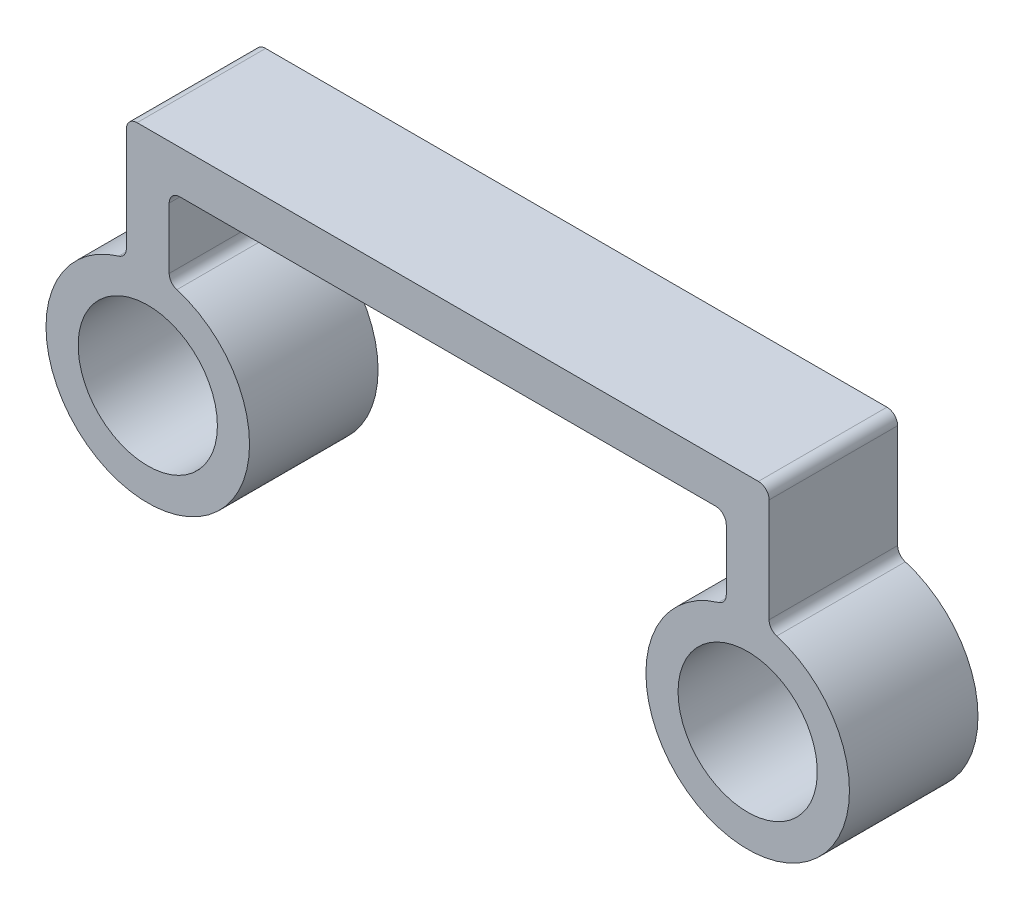
ISO-10303-21;
HEADER;
FILE_DESCRIPTION(('STEP AP214'),'2;1');
FILE_NAME('part.step','',(''),(''),'','','');
FILE_SCHEMA(('AUTOMOTIVE_DESIGN { 1 0 10303 214 1 1 1 1 }'));
ENDSEC;
DATA;
#1=APPLICATION_CONTEXT('core data for automotive mechanical design processes');
#2=APPLICATION_PROTOCOL_DEFINITION('international standard','automotive_design',2000,#1);
#3=PRODUCT_CONTEXT('',#1,'mechanical');
#4=PRODUCT('Part','Part','',(#3));
#5=PRODUCT_RELATED_PRODUCT_CATEGORY('part','',(#4));
#6=PRODUCT_DEFINITION_FORMATION('','',#4);
#7=PRODUCT_DEFINITION_CONTEXT('part definition',#1,'design');
#8=PRODUCT_DEFINITION('design','',#6,#7);
#9=PRODUCT_DEFINITION_SHAPE('','',#8);
#10=(LENGTH_UNIT() NAMED_UNIT(*) SI_UNIT(.MILLI.,.METRE.));
#11=(NAMED_UNIT(*) PLANE_ANGLE_UNIT() SI_UNIT($,.RADIAN.));
#12=(NAMED_UNIT(*) SI_UNIT($,.STERADIAN.) SOLID_ANGLE_UNIT());
#13=UNCERTAINTY_MEASURE_WITH_UNIT(LENGTH_MEASURE(1.E-05),#10,'distance_accuracy_value','');
#14=(GEOMETRIC_REPRESENTATION_CONTEXT(3) GLOBAL_UNCERTAINTY_ASSIGNED_CONTEXT((#13)) GLOBAL_UNIT_ASSIGNED_CONTEXT((#10,
#11,#12)) REPRESENTATION_CONTEXT('',''));
#15=CARTESIAN_POINT('',(0.,0.,0.));
#16=DIRECTION('',(0.,0.,1.));
#17=DIRECTION('',(1.,0.,0.));
#18=AXIS2_PLACEMENT_3D('',#15,#16,#17);
#19=CARTESIAN_POINT('',(-28.,0.,12.));
#20=DIRECTION('',(0.,0.,1.));
#21=DIRECTION('',(1.,0.,0.));
#22=AXIS2_PLACEMENT_3D('',#19,#20,#21);
#23=PLANE('',#22);
#24=DIRECTION('',(-1.,0.,0.));
#25=VECTOR('',#24,1.);
#26=CARTESIAN_POINT('',(-30.,20.75,12.));
#27=LINE('',#26,#25);
#28=CARTESIAN_POINT('',(29.,20.75,12.));
#29=VERTEX_POINT('',#28);
#30=CARTESIAN_POINT('',(-29.,20.75,12.));
#31=VERTEX_POINT('',#30);
#32=EDGE_CURVE('E273',#29,#31,#27,.T.);
#33=ORIENTED_EDGE('',*,*,#32,.T.);
#34=CARTESIAN_POINT('',(-29.,19.75,12.));
#35=DIRECTION('',(0.,0.,1.));
#36=DIRECTION('',(1.,0.,0.));
#37=AXIS2_PLACEMENT_3D('',#34,#35,#36);
#38=CIRCLE('',#37,1.);
#39=CARTESIAN_POINT('',(-30.,19.75,12.));
#40=VERTEX_POINT('',#39);
#41=EDGE_CURVE('E163',#31,#40,#38,.T.);
#42=ORIENTED_EDGE('',*,*,#41,.T.);
#43=DIRECTION('',(0.,-1.,0.));
#44=VECTOR('',#43,1.);
#45=CARTESIAN_POINT('',(-30.,9.28708781050335,12.));
#46=LINE('',#45,#44);
#47=CARTESIAN_POINT('',(-30.,10.0623058987491,12.));
#48=VERTEX_POINT('',#47);
#49=EDGE_CURVE('E190',#40,#48,#46,.T.);
#50=ORIENTED_EDGE('',*,*,#49,.T.);
#51=CARTESIAN_POINT('',(-31.,10.0623058987491,12.));
#52=DIRECTION('',(0.,0.,1.));
#53=DIRECTION('',(1.,0.,0.));
#54=AXIS2_PLACEMENT_3D('',#51,#52,#53);
#55=CIRCLE('',#54,1.);
#56=CARTESIAN_POINT('',(-30.7142857142857,9.10399105124914,12.));
#57=VERTEX_POINT('',#56);
#58=EDGE_CURVE('E162',#48,#57,#55,.F.);
#59=ORIENTED_EDGE('',*,*,#58,.T.);
#60=CARTESIAN_POINT('',(-28.,0.,12.));
#61=DIRECTION('',(0.,0.,1.));
#62=DIRECTION('',(1.,0.,0.));
#63=AXIS2_PLACEMENT_3D('',#60,#61,#62);
#64=CIRCLE('',#63,9.5);
#65=CARTESIAN_POINT('',(-25.2857142857143,9.10399105124914,12.));
#66=VERTEX_POINT('',#65);
#67=EDGE_CURVE('E172',#57,#66,#64,.T.);
#68=ORIENTED_EDGE('',*,*,#67,.T.);
#69=CARTESIAN_POINT('',(-25.,10.0623058987491,12.));
#70=DIRECTION('',(0.,0.,1.));
#71=DIRECTION('',(1.,0.,0.));
#72=AXIS2_PLACEMENT_3D('',#69,#70,#71);
#73=CIRCLE('',#72,1.);
#74=CARTESIAN_POINT('',(-26.,10.0623058987491,12.));
#75=VERTEX_POINT('',#74);
#76=EDGE_CURVE('E240',#66,#75,#73,.F.);
#77=ORIENTED_EDGE('',*,*,#76,.T.);
#78=DIRECTION('',(0.,1.,0.));
#79=VECTOR('',#78,1.);
#80=CARTESIAN_POINT('',(-26.,9.28708781050335,12.));
#81=LINE('',#80,#79);
#82=CARTESIAN_POINT('',(-26.,15.75,12.));
#83=VERTEX_POINT('',#82);
#84=EDGE_CURVE('E269',#75,#83,#81,.T.);
#85=ORIENTED_EDGE('',*,*,#84,.T.);
#86=CARTESIAN_POINT('',(-25.,15.75,12.));
#87=DIRECTION('',(0.,0.,1.));
#88=DIRECTION('',(1.,0.,0.));
#89=AXIS2_PLACEMENT_3D('',#86,#87,#88);
#90=CIRCLE('',#89,1.);
#91=CARTESIAN_POINT('',(-25.,16.75,12.));
#92=VERTEX_POINT('',#91);
#93=EDGE_CURVE('E11',#83,#92,#90,.F.);
#94=ORIENTED_EDGE('',*,*,#93,.T.);
#95=DIRECTION('',(1.,0.,0.));
#96=VECTOR('',#95,1.);
#97=CARTESIAN_POINT('',(-26.,16.75,12.));
#98=LINE('',#97,#96);
#99=CARTESIAN_POINT('',(25.,16.75,12.));
#100=VERTEX_POINT('',#99);
#101=EDGE_CURVE('E267',#92,#100,#98,.T.);
#102=ORIENTED_EDGE('',*,*,#101,.T.);
#103=CARTESIAN_POINT('',(25.,15.75,12.));
#104=DIRECTION('',(0.,0.,1.));
#105=DIRECTION('',(1.,0.,0.));
#106=AXIS2_PLACEMENT_3D('',#103,#104,#105);
#107=CIRCLE('',#106,1.);
#108=CARTESIAN_POINT('',(26.,15.75,12.));
#109=VERTEX_POINT('',#108);
#110=EDGE_CURVE('E252',#100,#109,#107,.F.);
#111=ORIENTED_EDGE('',*,*,#110,.T.);
#112=DIRECTION('',(0.,1.,0.));
#113=VECTOR('',#112,1.);
#114=CARTESIAN_POINT('',(26.,9.28708781050335,12.));
#115=LINE('',#114,#113);
#116=CARTESIAN_POINT('',(26.,10.0623058987491,12.));
#117=VERTEX_POINT('',#116);
#118=EDGE_CURVE('E279',#117,#109,#115,.T.);
#119=ORIENTED_EDGE('',*,*,#118,.F.);
#120=CARTESIAN_POINT('',(25.,10.0623058987491,12.));
#121=DIRECTION('',(0.,0.,1.));
#122=DIRECTION('',(1.,0.,0.));
#123=AXIS2_PLACEMENT_3D('',#120,#121,#122);
#124=CIRCLE('',#123,1.);
#125=CARTESIAN_POINT('',(25.2857142857143,9.10399105124914,12.));
#126=VERTEX_POINT('',#125);
#127=EDGE_CURVE('E244',#117,#126,#124,.F.);
#128=ORIENTED_EDGE('',*,*,#127,.T.);
#129=CARTESIAN_POINT('',(28.,0.,12.));
#130=DIRECTION('',(0.,0.,-1.));
#131=DIRECTION('',(-1.,0.,0.));
#132=AXIS2_PLACEMENT_3D('',#129,#130,#131);
#133=CIRCLE('',#132,9.5);
#134=CARTESIAN_POINT('',(30.7142857142857,9.10399105124914,12.));
#135=VERTEX_POINT('',#134);
#136=EDGE_CURVE('E284',#135,#126,#133,.T.);
#137=ORIENTED_EDGE('',*,*,#136,.F.);
#138=CARTESIAN_POINT('',(31.,10.0623058987491,12.));
#139=DIRECTION('',(0.,0.,1.));
#140=DIRECTION('',(1.,0.,0.));
#141=AXIS2_PLACEMENT_3D('',#138,#139,#140);
#142=CIRCLE('',#141,1.);
#143=CARTESIAN_POINT('',(30.,10.0623058987491,12.));
#144=VERTEX_POINT('',#143);
#145=EDGE_CURVE('E248',#135,#144,#142,.F.);
#146=ORIENTED_EDGE('',*,*,#145,.T.);
#147=DIRECTION('',(0.,-1.,0.));
#148=VECTOR('',#147,1.);
#149=CARTESIAN_POINT('',(30.,9.28708781050335,12.));
#150=LINE('',#149,#148);
#151=CARTESIAN_POINT('',(30.,19.75,12.));
#152=VERTEX_POINT('',#151);
#153=EDGE_CURVE('E294',#152,#144,#150,.T.);
#154=ORIENTED_EDGE('',*,*,#153,.F.);
#155=CARTESIAN_POINT('',(29.,19.75,12.));
#156=DIRECTION('',(0.,0.,1.));
#157=DIRECTION('',(1.,0.,0.));
#158=AXIS2_PLACEMENT_3D('',#155,#156,#157);
#159=CIRCLE('',#158,1.);
#160=EDGE_CURVE('E60',#152,#29,#159,.T.);
#161=ORIENTED_EDGE('',*,*,#160,.T.);
#162=EDGE_LOOP('',(#33,#42,#50,#59,#68,#77,#85,#94,#102,#111,#119,#128,#137,#146,#154,#161));
#163=FACE_BOUND('',#162,.T.);
#164=CARTESIAN_POINT('',(-28.,0.,12.));
#165=DIRECTION('',(0.,0.,1.));
#166=DIRECTION('',(1.,0.,0.));
#167=AXIS2_PLACEMENT_3D('',#164,#165,#166);
#168=CIRCLE('',#167,6.5);
#169=CARTESIAN_POINT('',(-21.5,0.,12.));
#170=VERTEX_POINT('',#169);
#171=EDGE_CURVE('E181',#170,#170,#168,.T.);
#172=ORIENTED_EDGE('',*,*,#171,.F.);
#173=EDGE_LOOP('',(#172));
#174=FACE_BOUND('',#173,.T.);
#175=CARTESIAN_POINT('',(28.,0.,12.));
#176=DIRECTION('',(0.,0.,-1.));
#177=DIRECTION('',(-1.,0.,0.));
#178=AXIS2_PLACEMENT_3D('',#175,#176,#177);
#179=CIRCLE('',#178,6.5);
#180=CARTESIAN_POINT('',(21.5,0.,12.));
#181=VERTEX_POINT('',#180);
#182=EDGE_CURVE('E291',#181,#181,#179,.T.);
#183=ORIENTED_EDGE('',*,*,#182,.T.);
#184=EDGE_LOOP('',(#183));
#185=FACE_BOUND('',#184,.T.);
#186=ADVANCED_FACE('F38',(#163,#174,#185),#23,.T.);
#187=CARTESIAN_POINT('',(-28.,0.,0.));
#188=DIRECTION('',(0.,0.,1.));
#189=DIRECTION('',(1.,0.,0.));
#190=AXIS2_PLACEMENT_3D('',#187,#188,#189);
#191=PLANE('',#190);
#192=DIRECTION('',(0.,-1.,0.));
#193=VECTOR('',#192,1.);
#194=CARTESIAN_POINT('',(-30.,9.28708781050335,0.));
#195=LINE('',#194,#193);
#196=CARTESIAN_POINT('',(-30.,19.75,0.));
#197=VERTEX_POINT('',#196);
#198=CARTESIAN_POINT('',(-30.,10.0623058987491,0.));
#199=VERTEX_POINT('',#198);
#200=EDGE_CURVE('E197',#197,#199,#195,.T.);
#201=ORIENTED_EDGE('',*,*,#200,.F.);
#202=CARTESIAN_POINT('',(-29.,19.75,0.));
#203=DIRECTION('',(0.,0.,1.));
#204=DIRECTION('',(1.,0.,0.));
#205=AXIS2_PLACEMENT_3D('',#202,#203,#204);
#206=CIRCLE('',#205,1.);
#207=CARTESIAN_POINT('',(-29.,20.75,0.));
#208=VERTEX_POINT('',#207);
#209=EDGE_CURVE('E230',#197,#208,#206,.F.);
#210=ORIENTED_EDGE('',*,*,#209,.T.);
#211=DIRECTION('',(-1.,0.,0.));
#212=VECTOR('',#211,1.);
#213=CARTESIAN_POINT('',(-30.,20.75,0.));
#214=LINE('',#213,#212);
#215=CARTESIAN_POINT('',(29.,20.75,0.));
#216=VERTEX_POINT('',#215);
#217=EDGE_CURVE('E195',#216,#208,#214,.T.);
#218=ORIENTED_EDGE('',*,*,#217,.F.);
#219=CARTESIAN_POINT('',(29.,19.75,0.));
#220=DIRECTION('',(0.,0.,1.));
#221=DIRECTION('',(1.,0.,0.));
#222=AXIS2_PLACEMENT_3D('',#219,#220,#221);
#223=CIRCLE('',#222,1.);
#224=CARTESIAN_POINT('',(30.,19.75,0.));
#225=VERTEX_POINT('',#224);
#226=EDGE_CURVE('E228',#216,#225,#223,.F.);
#227=ORIENTED_EDGE('',*,*,#226,.T.);
#228=DIRECTION('',(0.,-1.,0.));
#229=VECTOR('',#228,1.);
#230=CARTESIAN_POINT('',(30.,9.28708781050335,0.));
#231=LINE('',#230,#229);
#232=CARTESIAN_POINT('',(30.,10.0623058987491,0.));
#233=VERTEX_POINT('',#232);
#234=EDGE_CURVE('E285',#225,#233,#231,.T.);
#235=ORIENTED_EDGE('',*,*,#234,.T.);
#236=CARTESIAN_POINT('',(31.,10.0623058987491,0.));
#237=DIRECTION('',(0.,0.,1.));
#238=DIRECTION('',(1.,0.,0.));
#239=AXIS2_PLACEMENT_3D('',#236,#237,#238);
#240=CIRCLE('',#239,1.);
#241=CARTESIAN_POINT('',(30.7142857142857,9.10399105124914,0.));
#242=VERTEX_POINT('',#241);
#243=EDGE_CURVE('E246',#233,#242,#240,.T.);
#244=ORIENTED_EDGE('',*,*,#243,.T.);
#245=CARTESIAN_POINT('',(28.,0.,0.));
#246=DIRECTION('',(0.,0.,-1.));
#247=DIRECTION('',(-1.,0.,0.));
#248=AXIS2_PLACEMENT_3D('',#245,#246,#247);
#249=CIRCLE('',#248,9.5);
#250=CARTESIAN_POINT('',(25.2857142857143,9.10399105124914,0.));
#251=VERTEX_POINT('',#250);
#252=EDGE_CURVE('E288',#242,#251,#249,.T.);
#253=ORIENTED_EDGE('',*,*,#252,.T.);
#254=CARTESIAN_POINT('',(25.,10.0623058987491,0.));
#255=DIRECTION('',(0.,0.,1.));
#256=DIRECTION('',(1.,0.,0.));
#257=AXIS2_PLACEMENT_3D('',#254,#255,#256);
#258=CIRCLE('',#257,1.);
#259=CARTESIAN_POINT('',(26.,10.0623058987491,0.));
#260=VERTEX_POINT('',#259);
#261=EDGE_CURVE('E242',#251,#260,#258,.T.);
#262=ORIENTED_EDGE('',*,*,#261,.T.);
#263=DIRECTION('',(0.,1.,0.));
#264=VECTOR('',#263,1.);
#265=CARTESIAN_POINT('',(26.,9.28708781050335,0.));
#266=LINE('',#265,#264);
#267=CARTESIAN_POINT('',(26.,15.75,0.));
#268=VERTEX_POINT('',#267);
#269=EDGE_CURVE('E281',#260,#268,#266,.T.);
#270=ORIENTED_EDGE('',*,*,#269,.T.);
#271=CARTESIAN_POINT('',(25.,15.75,0.));
#272=DIRECTION('',(0.,0.,1.));
#273=DIRECTION('',(1.,0.,0.));
#274=AXIS2_PLACEMENT_3D('',#271,#272,#273);
#275=CIRCLE('',#274,1.);
#276=CARTESIAN_POINT('',(25.,16.75,0.));
#277=VERTEX_POINT('',#276);
#278=EDGE_CURVE('E250',#268,#277,#275,.T.);
#279=ORIENTED_EDGE('',*,*,#278,.T.);
#280=DIRECTION('',(1.,0.,0.));
#281=VECTOR('',#280,1.);
#282=CARTESIAN_POINT('',(-26.,16.75,0.));
#283=LINE('',#282,#281);
#284=CARTESIAN_POINT('',(-25.,16.75,0.));
#285=VERTEX_POINT('',#284);
#286=EDGE_CURVE('E184',#285,#277,#283,.T.);
#287=ORIENTED_EDGE('',*,*,#286,.F.);
#288=CARTESIAN_POINT('',(-25.,15.75,0.));
#289=DIRECTION('',(0.,0.,1.));
#290=DIRECTION('',(1.,0.,0.));
#291=AXIS2_PLACEMENT_3D('',#288,#289,#290);
#292=CIRCLE('',#291,1.);
#293=CARTESIAN_POINT('',(-26.,15.75,0.));
#294=VERTEX_POINT('',#293);
#295=EDGE_CURVE('E46',#285,#294,#292,.T.);
#296=ORIENTED_EDGE('',*,*,#295,.T.);
#297=DIRECTION('',(0.,1.,0.));
#298=VECTOR('',#297,1.);
#299=CARTESIAN_POINT('',(-26.,9.28708781050335,0.));
#300=LINE('',#299,#298);
#301=CARTESIAN_POINT('',(-26.,10.0623058987491,0.));
#302=VERTEX_POINT('',#301);
#303=EDGE_CURVE('E180',#302,#294,#300,.T.);
#304=ORIENTED_EDGE('',*,*,#303,.F.);
#305=CARTESIAN_POINT('',(-25.,10.0623058987491,0.));
#306=DIRECTION('',(0.,0.,1.));
#307=DIRECTION('',(1.,0.,0.));
#308=AXIS2_PLACEMENT_3D('',#305,#306,#307);
#309=CIRCLE('',#308,1.);
#310=CARTESIAN_POINT('',(-25.2857142857143,9.10399105124914,0.));
#311=VERTEX_POINT('',#310);
#312=EDGE_CURVE('E179',#302,#311,#309,.T.);
#313=ORIENTED_EDGE('',*,*,#312,.T.);
#314=CARTESIAN_POINT('',(-28.,0.,0.));
#315=DIRECTION('',(0.,0.,1.));
#316=DIRECTION('',(1.,0.,0.));
#317=AXIS2_PLACEMENT_3D('',#314,#315,#316);
#318=CIRCLE('',#317,9.5);
#319=CARTESIAN_POINT('',(-30.7142857142857,9.10399105124914,0.));
#320=VERTEX_POINT('',#319);
#321=EDGE_CURVE('E169',#320,#311,#318,.T.);
#322=ORIENTED_EDGE('',*,*,#321,.F.);
#323=CARTESIAN_POINT('',(-31.,10.0623058987491,0.));
#324=DIRECTION('',(0.,0.,1.));
#325=DIRECTION('',(1.,0.,0.));
#326=AXIS2_PLACEMENT_3D('',#323,#324,#325);
#327=CIRCLE('',#326,1.);
#328=EDGE_CURVE('E152',#320,#199,#327,.T.);
#329=ORIENTED_EDGE('',*,*,#328,.T.);
#330=EDGE_LOOP('',(#201,#210,#218,#227,#235,#244,#253,#262,#270,#279,#287,#296,#304,#313,#322,#329));
#331=FACE_BOUND('',#330,.T.);
#332=CARTESIAN_POINT('',(-28.,0.,0.));
#333=DIRECTION('',(0.,0.,1.));
#334=DIRECTION('',(1.,0.,0.));
#335=AXIS2_PLACEMENT_3D('',#332,#333,#334);
#336=CIRCLE('',#335,6.5);
#337=CARTESIAN_POINT('',(-21.5,0.,0.));
#338=VERTEX_POINT('',#337);
#339=EDGE_CURVE('E187',#338,#338,#336,.T.);
#340=ORIENTED_EDGE('',*,*,#339,.T.);
#341=EDGE_LOOP('',(#340));
#342=FACE_BOUND('',#341,.T.);
#343=CARTESIAN_POINT('',(28.,0.,0.));
#344=DIRECTION('',(0.,0.,-1.));
#345=DIRECTION('',(-1.,0.,0.));
#346=AXIS2_PLACEMENT_3D('',#343,#344,#345);
#347=CIRCLE('',#346,6.5);
#348=CARTESIAN_POINT('',(21.5,0.,0.));
#349=VERTEX_POINT('',#348);
#350=EDGE_CURVE('E299',#349,#349,#347,.T.);
#351=ORIENTED_EDGE('',*,*,#350,.F.);
#352=EDGE_LOOP('',(#351));
#353=FACE_BOUND('',#352,.T.);
#354=ADVANCED_FACE('F176',(#331,#342,#353),#191,.F.);
#355=CARTESIAN_POINT('',(-28.,0.,12.));
#356=DIRECTION('',(0.,0.,-1.));
#357=DIRECTION('',(-1.,0.,0.));
#358=AXIS2_PLACEMENT_3D('',#355,#356,#357);
#359=CYLINDRICAL_SURFACE('',#358,9.5);
#360=ORIENTED_EDGE('',*,*,#67,.F.);
#361=DIRECTION('',(0.,0.,-1.));
#362=VECTOR('',#361,1.);
#363=CARTESIAN_POINT('',(-30.7142857142857,9.10399105124914,12.));
#364=LINE('',#363,#362);
#365=EDGE_CURVE('E156',#57,#320,#364,.T.);
#366=ORIENTED_EDGE('',*,*,#365,.T.);
#367=ORIENTED_EDGE('',*,*,#321,.T.);
#368=DIRECTION('',(0.,0.,-1.));
#369=VECTOR('',#368,1.);
#370=CARTESIAN_POINT('',(-25.2857142857143,9.10399105124914,12.));
#371=LINE('',#370,#369);
#372=EDGE_CURVE('E174',#311,#66,#371,.F.);
#373=ORIENTED_EDGE('',*,*,#372,.T.);
#374=EDGE_LOOP('',(#360,#366,#367,#373));
#375=FACE_BOUND('',#374,.T.);
#376=ADVANCED_FACE('F168',(#375),#359,.T.);
#377=CARTESIAN_POINT('',(-26.,9.28708781050335,12.));
#378=DIRECTION('',(-1.,0.,0.));
#379=DIRECTION('',(0.,0.,1.));
#380=AXIS2_PLACEMENT_3D('',#377,#378,#379);
#381=PLANE('',#380);
#382=ORIENTED_EDGE('',*,*,#84,.F.);
#383=DIRECTION('',(0.,0.,1.));
#384=VECTOR('',#383,1.);
#385=CARTESIAN_POINT('',(-26.,10.0623058987491,0.));
#386=LINE('',#385,#384);
#387=EDGE_CURVE('E205',#75,#302,#386,.F.);
#388=ORIENTED_EDGE('',*,*,#387,.T.);
#389=ORIENTED_EDGE('',*,*,#303,.T.);
#390=DIRECTION('',(0.,0.,-1.));
#391=VECTOR('',#390,1.);
#392=CARTESIAN_POINT('',(-26.,15.75,12.));
#393=LINE('',#392,#391);
#394=EDGE_CURVE('E203',#294,#83,#393,.F.);
#395=ORIENTED_EDGE('',*,*,#394,.T.);
#396=EDGE_LOOP('',(#382,#388,#389,#395));
#397=FACE_BOUND('',#396,.T.);
#398=ADVANCED_FACE('F259',(#397),#381,.F.);
#399=CARTESIAN_POINT('',(-26.,16.75,12.));
#400=DIRECTION('',(0.,1.,0.));
#401=DIRECTION('',(0.,0.,1.));
#402=AXIS2_PLACEMENT_3D('',#399,#400,#401);
#403=PLANE('',#402);
#404=ORIENTED_EDGE('',*,*,#286,.T.);
#405=DIRECTION('',(0.,0.,-1.));
#406=VECTOR('',#405,1.);
#407=CARTESIAN_POINT('',(25.,16.75,12.));
#408=LINE('',#407,#406);
#409=EDGE_CURVE('E226',#277,#100,#408,.F.);
#410=ORIENTED_EDGE('',*,*,#409,.T.);
#411=ORIENTED_EDGE('',*,*,#101,.F.);
#412=DIRECTION('',(0.,0.,-1.));
#413=VECTOR('',#412,1.);
#414=CARTESIAN_POINT('',(-25.,16.75,0.));
#415=LINE('',#414,#413);
#416=EDGE_CURVE('E223',#92,#285,#415,.T.);
#417=ORIENTED_EDGE('',*,*,#416,.T.);
#418=EDGE_LOOP('',(#404,#410,#411,#417));
#419=FACE_BOUND('',#418,.T.);
#420=ADVANCED_FACE('F271',(#419),#403,.F.);
#421=CARTESIAN_POINT('',(-30.,20.75,12.));
#422=DIRECTION('',(0.,-1.,0.));
#423=DIRECTION('',(0.,0.,-1.));
#424=AXIS2_PLACEMENT_3D('',#421,#422,#423);
#425=PLANE('',#424);
#426=ORIENTED_EDGE('',*,*,#217,.T.);
#427=DIRECTION('',(0.,0.,-1.));
#428=VECTOR('',#427,1.);
#429=CARTESIAN_POINT('',(-29.,20.75,12.));
#430=LINE('',#429,#428);
#431=EDGE_CURVE('E53',#208,#31,#430,.F.);
#432=ORIENTED_EDGE('',*,*,#431,.T.);
#433=ORIENTED_EDGE('',*,*,#32,.F.);
#434=DIRECTION('',(0.,0.,-1.));
#435=VECTOR('',#434,1.);
#436=CARTESIAN_POINT('',(29.,20.75,0.));
#437=LINE('',#436,#435);
#438=EDGE_CURVE('E232',#29,#216,#437,.T.);
#439=ORIENTED_EDGE('',*,*,#438,.T.);
#440=EDGE_LOOP('',(#426,#432,#433,#439));
#441=FACE_BOUND('',#440,.T.);
#442=ADVANCED_FACE('F327',(#441),#425,.F.);
#443=CARTESIAN_POINT('',(-30.,9.28708781050335,12.));
#444=DIRECTION('',(1.,0.,0.));
#445=DIRECTION('',(0.,0.,-1.));
#446=AXIS2_PLACEMENT_3D('',#443,#444,#445);
#447=PLANE('',#446);
#448=ORIENTED_EDGE('',*,*,#200,.T.);
#449=DIRECTION('',(0.,0.,1.));
#450=VECTOR('',#449,1.);
#451=CARTESIAN_POINT('',(-30.,10.0623058987491,12.));
#452=LINE('',#451,#450);
#453=EDGE_CURVE('E157',#199,#48,#452,.T.);
#454=ORIENTED_EDGE('',*,*,#453,.T.);
#455=ORIENTED_EDGE('',*,*,#49,.F.);
#456=DIRECTION('',(0.,0.,-1.));
#457=VECTOR('',#456,1.);
#458=CARTESIAN_POINT('',(-30.,19.75,12.));
#459=LINE('',#458,#457);
#460=EDGE_CURVE('E173',#40,#197,#459,.T.);
#461=ORIENTED_EDGE('',*,*,#460,.T.);
#462=EDGE_LOOP('',(#448,#454,#455,#461));
#463=FACE_BOUND('',#462,.T.);
#464=ADVANCED_FACE('F323',(#463),#447,.F.);
#465=CARTESIAN_POINT('',(-28.,0.,12.));
#466=DIRECTION('',(0.,0.,-1.));
#467=DIRECTION('',(-1.,0.,0.));
#468=AXIS2_PLACEMENT_3D('',#465,#466,#467);
#469=CYLINDRICAL_SURFACE('',#468,6.5);
#470=ORIENTED_EDGE('',*,*,#171,.T.);
#471=EDGE_LOOP('',(#470));
#472=FACE_BOUND('',#471,.T.);
#473=ORIENTED_EDGE('',*,*,#339,.F.);
#474=EDGE_LOOP('',(#473));
#475=FACE_BOUND('',#474,.T.);
#476=ADVANCED_FACE('F326',(#472,#475),#469,.F.);
#477=CARTESIAN_POINT('',(28.,0.,12.));
#478=DIRECTION('',(0.,0.,-1.));
#479=DIRECTION('',(-1.,0.,0.));
#480=AXIS2_PLACEMENT_3D('',#477,#478,#479);
#481=CYLINDRICAL_SURFACE('',#480,9.5);
#482=ORIENTED_EDGE('',*,*,#136,.T.);
#483=DIRECTION('',(0.,0.,-1.));
#484=VECTOR('',#483,1.);
#485=CARTESIAN_POINT('',(25.2857142857143,9.10399105124914,12.));
#486=LINE('',#485,#484);
#487=EDGE_CURVE('E210',#126,#251,#486,.T.);
#488=ORIENTED_EDGE('',*,*,#487,.T.);
#489=ORIENTED_EDGE('',*,*,#252,.F.);
#490=DIRECTION('',(0.,0.,-1.));
#491=VECTOR('',#490,1.);
#492=CARTESIAN_POINT('',(30.7142857142857,9.10399105124914,12.));
#493=LINE('',#492,#491);
#494=EDGE_CURVE('E208',#242,#135,#493,.F.);
#495=ORIENTED_EDGE('',*,*,#494,.T.);
#496=EDGE_LOOP('',(#482,#488,#489,#495));
#497=FACE_BOUND('',#496,.T.);
#498=ADVANCED_FACE('F376',(#497),#481,.T.);
#499=CARTESIAN_POINT('',(30.,9.28708781050335,12.));
#500=DIRECTION('',(1.,0.,0.));
#501=DIRECTION('',(0.,0.,-1.));
#502=AXIS2_PLACEMENT_3D('',#499,#500,#501);
#503=PLANE('',#502);
#504=ORIENTED_EDGE('',*,*,#153,.T.);
#505=DIRECTION('',(0.,0.,1.));
#506=VECTOR('',#505,1.);
#507=CARTESIAN_POINT('',(30.,10.0623058987491,0.));
#508=LINE('',#507,#506);
#509=EDGE_CURVE('E220',#144,#233,#508,.F.);
#510=ORIENTED_EDGE('',*,*,#509,.T.);
#511=ORIENTED_EDGE('',*,*,#234,.F.);
#512=DIRECTION('',(0.,0.,-1.));
#513=VECTOR('',#512,1.);
#514=CARTESIAN_POINT('',(30.,19.75,12.));
#515=LINE('',#514,#513);
#516=EDGE_CURVE('E218',#225,#152,#515,.F.);
#517=ORIENTED_EDGE('',*,*,#516,.T.);
#518=EDGE_LOOP('',(#504,#510,#511,#517));
#519=FACE_BOUND('',#518,.T.);
#520=ADVANCED_FACE('F370',(#519),#503,.T.);
#521=CARTESIAN_POINT('',(26.,9.28708781050335,12.));
#522=DIRECTION('',(-1.,0.,0.));
#523=DIRECTION('',(0.,0.,1.));
#524=AXIS2_PLACEMENT_3D('',#521,#522,#523);
#525=PLANE('',#524);
#526=ORIENTED_EDGE('',*,*,#269,.F.);
#527=DIRECTION('',(0.,0.,1.));
#528=VECTOR('',#527,1.);
#529=CARTESIAN_POINT('',(26.,10.0623058987491,12.));
#530=LINE('',#529,#528);
#531=EDGE_CURVE('E216',#260,#117,#530,.T.);
#532=ORIENTED_EDGE('',*,*,#531,.T.);
#533=ORIENTED_EDGE('',*,*,#118,.T.);
#534=DIRECTION('',(0.,0.,-1.));
#535=VECTOR('',#534,1.);
#536=CARTESIAN_POINT('',(26.,15.75,12.));
#537=LINE('',#536,#535);
#538=EDGE_CURVE('E213',#109,#268,#537,.T.);
#539=ORIENTED_EDGE('',*,*,#538,.T.);
#540=EDGE_LOOP('',(#526,#532,#533,#539));
#541=FACE_BOUND('',#540,.T.);
#542=ADVANCED_FACE('F309',(#541),#525,.T.);
#543=CARTESIAN_POINT('',(28.,0.,12.));
#544=DIRECTION('',(0.,0.,-1.));
#545=DIRECTION('',(-1.,0.,0.));
#546=AXIS2_PLACEMENT_3D('',#543,#544,#545);
#547=CYLINDRICAL_SURFACE('',#546,6.5);
#548=ORIENTED_EDGE('',*,*,#182,.F.);
#549=EDGE_LOOP('',(#548));
#550=FACE_BOUND('',#549,.T.);
#551=ORIENTED_EDGE('',*,*,#350,.T.);
#552=EDGE_LOOP('',(#551));
#553=FACE_BOUND('',#552,.T.);
#554=ADVANCED_FACE('F306',(#550,#553),#547,.F.);
#555=CARTESIAN_POINT('',(-31.,10.0623058987491,12.));
#556=DIRECTION('',(0.,0.,-1.));
#557=DIRECTION('',(-1.,0.,0.));
#558=AXIS2_PLACEMENT_3D('',#555,#556,#557);
#559=CYLINDRICAL_SURFACE('',#558,1.);
#560=ORIENTED_EDGE('',*,*,#58,.F.);
#561=ORIENTED_EDGE('',*,*,#453,.F.);
#562=ORIENTED_EDGE('',*,*,#328,.F.);
#563=ORIENTED_EDGE('',*,*,#365,.F.);
#564=EDGE_LOOP('',(#560,#561,#562,#563));
#565=FACE_BOUND('',#564,.T.);
#566=ADVANCED_FACE('F155',(#565),#559,.F.);
#567=CARTESIAN_POINT('',(-25.,10.0623058987491,12.));
#568=DIRECTION('',(0.,0.,-1.));
#569=DIRECTION('',(-1.,0.,0.));
#570=AXIS2_PLACEMENT_3D('',#567,#568,#569);
#571=CYLINDRICAL_SURFACE('',#570,1.);
#572=ORIENTED_EDGE('',*,*,#76,.F.);
#573=ORIENTED_EDGE('',*,*,#372,.F.);
#574=ORIENTED_EDGE('',*,*,#312,.F.);
#575=ORIENTED_EDGE('',*,*,#387,.F.);
#576=EDGE_LOOP('',(#572,#573,#574,#575));
#577=FACE_BOUND('',#576,.T.);
#578=ADVANCED_FACE('F337',(#577),#571,.F.);
#579=CARTESIAN_POINT('',(25.,10.0623058987491,12.));
#580=DIRECTION('',(0.,0.,-1.));
#581=DIRECTION('',(-1.,0.,0.));
#582=AXIS2_PLACEMENT_3D('',#579,#580,#581);
#583=CYLINDRICAL_SURFACE('',#582,1.);
#584=ORIENTED_EDGE('',*,*,#127,.F.);
#585=ORIENTED_EDGE('',*,*,#531,.F.);
#586=ORIENTED_EDGE('',*,*,#261,.F.);
#587=ORIENTED_EDGE('',*,*,#487,.F.);
#588=EDGE_LOOP('',(#584,#585,#586,#587));
#589=FACE_BOUND('',#588,.T.);
#590=ADVANCED_FACE('F340',(#589),#583,.F.);
#591=CARTESIAN_POINT('',(31.,10.0623058987491,12.));
#592=DIRECTION('',(0.,0.,-1.));
#593=DIRECTION('',(-1.,0.,0.));
#594=AXIS2_PLACEMENT_3D('',#591,#592,#593);
#595=CYLINDRICAL_SURFACE('',#594,1.);
#596=ORIENTED_EDGE('',*,*,#145,.F.);
#597=ORIENTED_EDGE('',*,*,#494,.F.);
#598=ORIENTED_EDGE('',*,*,#243,.F.);
#599=ORIENTED_EDGE('',*,*,#509,.F.);
#600=EDGE_LOOP('',(#596,#597,#598,#599));
#601=FACE_BOUND('',#600,.T.);
#602=ADVANCED_FACE('F344',(#601),#595,.F.);
#603=CARTESIAN_POINT('',(25.,15.75,12.));
#604=DIRECTION('',(0.,0.,-1.));
#605=DIRECTION('',(-1.,0.,0.));
#606=AXIS2_PLACEMENT_3D('',#603,#604,#605);
#607=CYLINDRICAL_SURFACE('',#606,1.);
#608=ORIENTED_EDGE('',*,*,#110,.F.);
#609=ORIENTED_EDGE('',*,*,#409,.F.);
#610=ORIENTED_EDGE('',*,*,#278,.F.);
#611=ORIENTED_EDGE('',*,*,#538,.F.);
#612=EDGE_LOOP('',(#608,#609,#610,#611));
#613=FACE_BOUND('',#612,.T.);
#614=ADVANCED_FACE('F348',(#613),#607,.F.);
#615=CARTESIAN_POINT('',(-25.,15.75,12.));
#616=DIRECTION('',(0.,0.,1.));
#617=DIRECTION('',(1.,0.,0.));
#618=AXIS2_PLACEMENT_3D('',#615,#616,#617);
#619=CYLINDRICAL_SURFACE('',#618,1.);
#620=ORIENTED_EDGE('',*,*,#93,.F.);
#621=ORIENTED_EDGE('',*,*,#394,.F.);
#622=ORIENTED_EDGE('',*,*,#295,.F.);
#623=ORIENTED_EDGE('',*,*,#416,.F.);
#624=EDGE_LOOP('',(#620,#621,#622,#623));
#625=FACE_BOUND('',#624,.T.);
#626=ADVANCED_FACE('F263',(#625),#619,.F.);
#627=CARTESIAN_POINT('',(-29.,19.75,12.));
#628=DIRECTION('',(0.,0.,-1.));
#629=DIRECTION('',(-1.,0.,0.));
#630=AXIS2_PLACEMENT_3D('',#627,#628,#629);
#631=CYLINDRICAL_SURFACE('',#630,1.);
#632=ORIENTED_EDGE('',*,*,#41,.F.);
#633=ORIENTED_EDGE('',*,*,#431,.F.);
#634=ORIENTED_EDGE('',*,*,#209,.F.);
#635=ORIENTED_EDGE('',*,*,#460,.F.);
#636=EDGE_LOOP('',(#632,#633,#634,#635));
#637=FACE_BOUND('',#636,.T.);
#638=ADVANCED_FACE('F354',(#637),#631,.T.);
#639=CARTESIAN_POINT('',(29.,19.75,12.));
#640=DIRECTION('',(0.,0.,1.));
#641=DIRECTION('',(1.,0.,0.));
#642=AXIS2_PLACEMENT_3D('',#639,#640,#641);
#643=CYLINDRICAL_SURFACE('',#642,1.);
#644=ORIENTED_EDGE('',*,*,#160,.F.);
#645=ORIENTED_EDGE('',*,*,#516,.F.);
#646=ORIENTED_EDGE('',*,*,#226,.F.);
#647=ORIENTED_EDGE('',*,*,#438,.F.);
#648=EDGE_LOOP('',(#644,#645,#646,#647));
#649=FACE_BOUND('',#648,.T.);
#650=ADVANCED_FACE('F40',(#649),#643,.T.);
#651=CLOSED_SHELL('',(#186,#354,#376,#398,#420,#442,#464,#476,#498,#520,#542,#554,#566,#578,
#590,#602,#614,#626,#638,#650));
#652=MANIFOLD_SOLID_BREP('B2',#651);
#653=ADVANCED_BREP_SHAPE_REPRESENTATION('',(#18,#652),#14);
#654=SHAPE_DEFINITION_REPRESENTATION(#9,#653);
ENDSEC;
END-ISO-10303-21;
